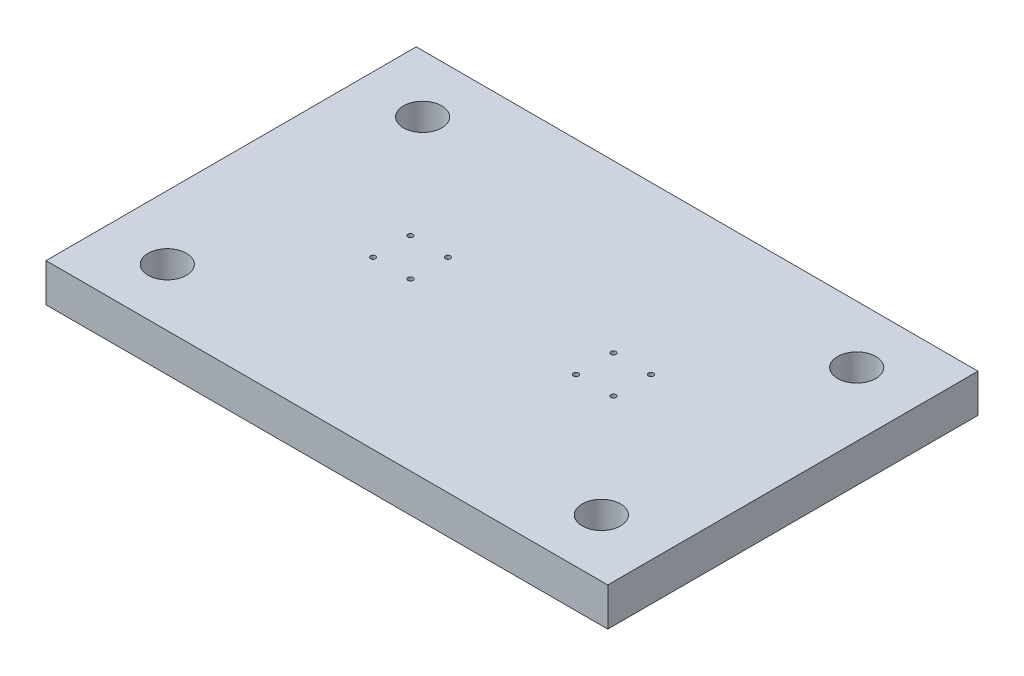
ISO-10303-21;
HEADER;
FILE_DESCRIPTION(('STEP AP214'),'2;1');
FILE_NAME('part.step','',(''),(''),'','','');
FILE_SCHEMA(('AUTOMOTIVE_DESIGN { 1 0 10303 214 1 1 1 1 }'));
ENDSEC;
DATA;
#1=APPLICATION_CONTEXT('core data for automotive mechanical design processes');
#2=APPLICATION_PROTOCOL_DEFINITION('international standard','automotive_design',2000,#1);
#3=PRODUCT_CONTEXT('',#1,'mechanical');
#4=PRODUCT('Part','Part','',(#3));
#5=PRODUCT_RELATED_PRODUCT_CATEGORY('part','',(#4));
#6=PRODUCT_DEFINITION_FORMATION('','',#4);
#7=PRODUCT_DEFINITION_CONTEXT('part definition',#1,'design');
#8=PRODUCT_DEFINITION('design','',#6,#7);
#9=PRODUCT_DEFINITION_SHAPE('','',#8);
#10=(LENGTH_UNIT() NAMED_UNIT(*) SI_UNIT(.MILLI.,.METRE.));
#11=(NAMED_UNIT(*) PLANE_ANGLE_UNIT() SI_UNIT($,.RADIAN.));
#12=(NAMED_UNIT(*) SI_UNIT($,.STERADIAN.) SOLID_ANGLE_UNIT());
#13=UNCERTAINTY_MEASURE_WITH_UNIT(LENGTH_MEASURE(1.E-05),#10,'distance_accuracy_value','');
#14=(GEOMETRIC_REPRESENTATION_CONTEXT(3) GLOBAL_UNCERTAINTY_ASSIGNED_CONTEXT((#13)) GLOBAL_UNIT_ASSIGNED_CONTEXT((#10,
#11,#12)) REPRESENTATION_CONTEXT('',''));
#15=CARTESIAN_POINT('',(0.,0.,0.));
#16=DIRECTION('',(0.,0.,1.));
#17=DIRECTION('',(1.,0.,0.));
#18=AXIS2_PLACEMENT_3D('',#15,#16,#17);
#19=CARTESIAN_POINT('',(440.,60.,-290.));
#20=DIRECTION('',(-1.,0.,0.));
#21=DIRECTION('',(0.,0.,1.));
#22=AXIS2_PLACEMENT_3D('',#19,#20,#21);
#23=PLANE('',#22);
#24=DIRECTION('',(0.,0.,-1.));
#25=VECTOR('',#24,1.);
#26=CARTESIAN_POINT('',(440.,0.,-290.));
#27=LINE('',#26,#25);
#28=CARTESIAN_POINT('',(440.,0.,290.));
#29=VERTEX_POINT('',#28);
#30=CARTESIAN_POINT('',(440.,0.,-290.));
#31=VERTEX_POINT('',#30);
#32=EDGE_CURVE('E99',#29,#31,#27,.T.);
#33=ORIENTED_EDGE('',*,*,#32,.T.);
#34=DIRECTION('',(0.,-1.,0.));
#35=VECTOR('',#34,1.);
#36=CARTESIAN_POINT('',(440.,60.,-290.));
#37=LINE('',#36,#35);
#38=CARTESIAN_POINT('',(440.,60.,-290.));
#39=VERTEX_POINT('',#38);
#40=EDGE_CURVE('E11',#39,#31,#37,.T.);
#41=ORIENTED_EDGE('',*,*,#40,.F.);
#42=DIRECTION('',(0.,0.,-1.));
#43=VECTOR('',#42,1.);
#44=CARTESIAN_POINT('',(440.,60.,-290.));
#45=LINE('',#44,#43);
#46=CARTESIAN_POINT('',(440.,60.,290.));
#47=VERTEX_POINT('',#46);
#48=EDGE_CURVE('E86',#47,#39,#45,.T.);
#49=ORIENTED_EDGE('',*,*,#48,.F.);
#50=DIRECTION('',(0.,-1.,0.));
#51=VECTOR('',#50,1.);
#52=CARTESIAN_POINT('',(440.,60.,290.));
#53=LINE('',#52,#51);
#54=EDGE_CURVE('E95',#47,#29,#53,.T.);
#55=ORIENTED_EDGE('',*,*,#54,.T.);
#56=EDGE_LOOP('',(#33,#41,#49,#55));
#57=FACE_BOUND('',#56,.T.);
#58=ADVANCED_FACE('F33',(#57),#23,.F.);
#59=CARTESIAN_POINT('',(-440.,60.,-290.));
#60=DIRECTION('',(0.,0.,1.));
#61=DIRECTION('',(1.,0.,0.));
#62=AXIS2_PLACEMENT_3D('',#59,#60,#61);
#63=PLANE('',#62);
#64=DIRECTION('',(-1.,0.,0.));
#65=VECTOR('',#64,1.);
#66=CARTESIAN_POINT('',(-440.,0.,-290.));
#67=LINE('',#66,#65);
#68=CARTESIAN_POINT('',(-440.,0.,-290.));
#69=VERTEX_POINT('',#68);
#70=EDGE_CURVE('E90',#31,#69,#67,.T.);
#71=ORIENTED_EDGE('',*,*,#70,.T.);
#72=DIRECTION('',(0.,-1.,0.));
#73=VECTOR('',#72,1.);
#74=CARTESIAN_POINT('',(-440.,60.,-290.));
#75=LINE('',#74,#73);
#76=CARTESIAN_POINT('',(-440.,60.,-290.));
#77=VERTEX_POINT('',#76);
#78=EDGE_CURVE('E42',#77,#69,#75,.T.);
#79=ORIENTED_EDGE('',*,*,#78,.F.);
#80=DIRECTION('',(-1.,0.,0.));
#81=VECTOR('',#80,1.);
#82=CARTESIAN_POINT('',(-440.,60.,-290.));
#83=LINE('',#82,#81);
#84=EDGE_CURVE('E81',#39,#77,#83,.T.);
#85=ORIENTED_EDGE('',*,*,#84,.F.);
#86=ORIENTED_EDGE('',*,*,#40,.T.);
#87=EDGE_LOOP('',(#71,#79,#85,#86));
#88=FACE_BOUND('',#87,.T.);
#89=ADVANCED_FACE('F89',(#88),#63,.F.);
#90=CARTESIAN_POINT('',(-440.,60.,-290.));
#91=DIRECTION('',(1.,0.,0.));
#92=DIRECTION('',(0.,0.,-1.));
#93=AXIS2_PLACEMENT_3D('',#90,#91,#92);
#94=PLANE('',#93);
#95=DIRECTION('',(0.,0.,1.));
#96=VECTOR('',#95,1.);
#97=CARTESIAN_POINT('',(-440.,0.,-290.));
#98=LINE('',#97,#96);
#99=CARTESIAN_POINT('',(-440.,0.,290.));
#100=VERTEX_POINT('',#99);
#101=EDGE_CURVE('E68',#69,#100,#98,.T.);
#102=ORIENTED_EDGE('',*,*,#101,.T.);
#103=DIRECTION('',(0.,-1.,0.));
#104=VECTOR('',#103,1.);
#105=CARTESIAN_POINT('',(-440.,60.,290.));
#106=LINE('',#105,#104);
#107=CARTESIAN_POINT('',(-440.,60.,290.));
#108=VERTEX_POINT('',#107);
#109=EDGE_CURVE('E91',#108,#100,#106,.T.);
#110=ORIENTED_EDGE('',*,*,#109,.F.);
#111=DIRECTION('',(0.,0.,1.));
#112=VECTOR('',#111,1.);
#113=CARTESIAN_POINT('',(-440.,60.,-290.));
#114=LINE('',#113,#112);
#115=EDGE_CURVE('E84',#77,#108,#114,.T.);
#116=ORIENTED_EDGE('',*,*,#115,.F.);
#117=ORIENTED_EDGE('',*,*,#78,.T.);
#118=EDGE_LOOP('',(#102,#110,#116,#117));
#119=FACE_BOUND('',#118,.T.);
#120=ADVANCED_FACE('F93',(#119),#94,.F.);
#121=CARTESIAN_POINT('',(-440.,60.,290.));
#122=DIRECTION('',(0.,0.,-1.));
#123=DIRECTION('',(-1.,0.,0.));
#124=AXIS2_PLACEMENT_3D('',#121,#122,#123);
#125=PLANE('',#124);
#126=DIRECTION('',(1.,0.,0.));
#127=VECTOR('',#126,1.);
#128=CARTESIAN_POINT('',(-440.,0.,290.));
#129=LINE('',#128,#127);
#130=EDGE_CURVE('E74',#100,#29,#129,.T.);
#131=ORIENTED_EDGE('',*,*,#130,.T.);
#132=ORIENTED_EDGE('',*,*,#54,.F.);
#133=DIRECTION('',(1.,0.,0.));
#134=VECTOR('',#133,1.);
#135=CARTESIAN_POINT('',(-440.,60.,290.));
#136=LINE('',#135,#134);
#137=EDGE_CURVE('E51',#108,#47,#136,.T.);
#138=ORIENTED_EDGE('',*,*,#137,.F.);
#139=ORIENTED_EDGE('',*,*,#109,.T.);
#140=EDGE_LOOP('',(#131,#132,#138,#139));
#141=FACE_BOUND('',#140,.T.);
#142=ADVANCED_FACE('F185',(#141),#125,.F.);
#143=CARTESIAN_POINT('',(0.,60.,0.));
#144=DIRECTION('',(0.,1.,0.));
#145=DIRECTION('',(0.,0.,1.));
#146=AXIS2_PLACEMENT_3D('',#143,#144,#145);
#147=PLANE('',#146);
#148=CARTESIAN_POINT('',(129.655068580758,60.,-29.3449314192418));
#149=DIRECTION('',(0.,1.,0.));
#150=DIRECTION('',(0.,0.,-1.));
#151=AXIS2_PLACEMENT_3D('',#148,#149,#150);
#152=CIRCLE('',#151,3.99999999999999);
#153=CARTESIAN_POINT('',(129.655068580758,60.,-33.3449314192418));
#154=VERTEX_POINT('',#153);
#155=EDGE_CURVE('E158',#154,#154,#152,.T.);
#156=ORIENTED_EDGE('',*,*,#155,.F.);
#157=EDGE_LOOP('',(#156));
#158=FACE_BOUND('',#157,.T.);
#159=CARTESIAN_POINT('',(129.655068580758,60.,29.3449314192418));
#160=DIRECTION('',(0.,1.,0.));
#161=DIRECTION('',(0.,0.,-1.));
#162=AXIS2_PLACEMENT_3D('',#159,#160,#161);
#163=CIRCLE('',#162,3.99999999999999);
#164=CARTESIAN_POINT('',(129.655068580758,60.,25.3449314192418));
#165=VERTEX_POINT('',#164);
#166=EDGE_CURVE('E148',#165,#165,#163,.T.);
#167=ORIENTED_EDGE('',*,*,#166,.F.);
#168=EDGE_LOOP('',(#167));
#169=FACE_BOUND('',#168,.T.);
#170=CARTESIAN_POINT('',(188.344931419241,60.,29.3449314192424));
#171=DIRECTION('',(0.,1.,0.));
#172=DIRECTION('',(0.,0.,-1.));
#173=AXIS2_PLACEMENT_3D('',#170,#171,#172);
#174=CIRCLE('',#173,4.00000000000001);
#175=CARTESIAN_POINT('',(188.344931419241,60.,25.3449314192424));
#176=VERTEX_POINT('',#175);
#177=EDGE_CURVE('E145',#176,#176,#174,.T.);
#178=ORIENTED_EDGE('',*,*,#177,.F.);
#179=EDGE_LOOP('',(#178));
#180=FACE_BOUND('',#179,.T.);
#181=CARTESIAN_POINT('',(188.344931419241,60.,-29.3449314192412));
#182=DIRECTION('',(0.,1.,0.));
#183=DIRECTION('',(0.,0.,-1.));
#184=AXIS2_PLACEMENT_3D('',#181,#182,#183);
#185=CIRCLE('',#184,4.);
#186=CARTESIAN_POINT('',(188.344931419241,60.,-33.3449314192412));
#187=VERTEX_POINT('',#186);
#188=EDGE_CURVE('E142',#187,#187,#185,.T.);
#189=ORIENTED_EDGE('',*,*,#188,.F.);
#190=EDGE_LOOP('',(#189));
#191=FACE_BOUND('',#190,.T.);
#192=CARTESIAN_POINT('',(-188.344931419241,60.,-29.3449314192412));
#193=DIRECTION('',(0.,1.,0.));
#194=DIRECTION('',(0.,0.,1.));
#195=AXIS2_PLACEMENT_3D('',#192,#193,#194);
#196=CIRCLE('',#195,4.);
#197=CARTESIAN_POINT('',(-188.344931419241,60.,-25.3449314192412));
#198=VERTEX_POINT('',#197);
#199=EDGE_CURVE('E138',#198,#198,#196,.T.);
#200=ORIENTED_EDGE('',*,*,#199,.F.);
#201=EDGE_LOOP('',(#200));
#202=FACE_BOUND('',#201,.T.);
#203=CARTESIAN_POINT('',(-188.344931419241,60.,29.3449314192424));
#204=DIRECTION('',(0.,1.,0.));
#205=DIRECTION('',(0.,0.,1.));
#206=AXIS2_PLACEMENT_3D('',#203,#204,#205);
#207=CIRCLE('',#206,4.00000000000001);
#208=CARTESIAN_POINT('',(-188.344931419241,60.,33.3449314192424));
#209=VERTEX_POINT('',#208);
#210=EDGE_CURVE('E134',#209,#209,#207,.T.);
#211=ORIENTED_EDGE('',*,*,#210,.F.);
#212=EDGE_LOOP('',(#211));
#213=FACE_BOUND('',#212,.T.);
#214=CARTESIAN_POINT('',(-129.655068580758,60.,29.3449314192418));
#215=DIRECTION('',(0.,1.,0.));
#216=DIRECTION('',(0.,0.,1.));
#217=AXIS2_PLACEMENT_3D('',#214,#215,#216);
#218=CIRCLE('',#217,3.99999999999999);
#219=CARTESIAN_POINT('',(-129.655068580758,60.,33.3449314192418));
#220=VERTEX_POINT('',#219);
#221=EDGE_CURVE('E130',#220,#220,#218,.T.);
#222=ORIENTED_EDGE('',*,*,#221,.F.);
#223=EDGE_LOOP('',(#222));
#224=FACE_BOUND('',#223,.T.);
#225=CARTESIAN_POINT('',(-129.655068580758,60.,-29.3449314192418));
#226=DIRECTION('',(0.,1.,0.));
#227=DIRECTION('',(0.,0.,1.));
#228=AXIS2_PLACEMENT_3D('',#225,#226,#227);
#229=CIRCLE('',#228,3.99999999999999);
#230=CARTESIAN_POINT('',(-129.655068580758,60.,-25.3449314192418));
#231=VERTEX_POINT('',#230);
#232=EDGE_CURVE('E126',#231,#231,#229,.T.);
#233=ORIENTED_EDGE('',*,*,#232,.F.);
#234=EDGE_LOOP('',(#233));
#235=FACE_BOUND('',#234,.T.);
#236=CARTESIAN_POINT('',(-340.,60.,200.));
#237=DIRECTION('',(0.,1.,0.));
#238=DIRECTION('',(0.,0.,-1.));
#239=AXIS2_PLACEMENT_3D('',#236,#237,#238);
#240=CIRCLE('',#239,30.);
#241=CARTESIAN_POINT('',(-340.,60.,170.));
#242=VERTEX_POINT('',#241);
#243=EDGE_CURVE('E122',#242,#242,#240,.T.);
#244=ORIENTED_EDGE('',*,*,#243,.F.);
#245=EDGE_LOOP('',(#244));
#246=FACE_BOUND('',#245,.T.);
#247=CARTESIAN_POINT('',(340.,60.,200.));
#248=DIRECTION('',(0.,1.,0.));
#249=DIRECTION('',(0.,0.,-1.));
#250=AXIS2_PLACEMENT_3D('',#247,#248,#249);
#251=CIRCLE('',#250,30.);
#252=CARTESIAN_POINT('',(340.,60.,170.));
#253=VERTEX_POINT('',#252);
#254=EDGE_CURVE('E118',#253,#253,#251,.T.);
#255=ORIENTED_EDGE('',*,*,#254,.F.);
#256=EDGE_LOOP('',(#255));
#257=FACE_BOUND('',#256,.T.);
#258=CARTESIAN_POINT('',(340.,60.,-200.));
#259=DIRECTION('',(0.,1.,0.));
#260=DIRECTION('',(0.,0.,1.));
#261=AXIS2_PLACEMENT_3D('',#258,#259,#260);
#262=CIRCLE('',#261,30.);
#263=CARTESIAN_POINT('',(340.,60.,-170.));
#264=VERTEX_POINT('',#263);
#265=EDGE_CURVE('E114',#264,#264,#262,.T.);
#266=ORIENTED_EDGE('',*,*,#265,.F.);
#267=EDGE_LOOP('',(#266));
#268=FACE_BOUND('',#267,.T.);
#269=CARTESIAN_POINT('',(-340.,60.,-200.));
#270=DIRECTION('',(0.,1.,0.));
#271=DIRECTION('',(0.,0.,1.));
#272=AXIS2_PLACEMENT_3D('',#269,#270,#271);
#273=CIRCLE('',#272,30.);
#274=CARTESIAN_POINT('',(-340.,60.,-170.));
#275=VERTEX_POINT('',#274);
#276=EDGE_CURVE('E110',#275,#275,#273,.T.);
#277=ORIENTED_EDGE('',*,*,#276,.F.);
#278=EDGE_LOOP('',(#277));
#279=FACE_BOUND('',#278,.T.);
#280=ORIENTED_EDGE('',*,*,#48,.T.);
#281=ORIENTED_EDGE('',*,*,#84,.T.);
#282=ORIENTED_EDGE('',*,*,#115,.T.);
#283=ORIENTED_EDGE('',*,*,#137,.T.);
#284=EDGE_LOOP('',(#280,#281,#282,#283));
#285=FACE_BOUND('',#284,.T.);
#286=ADVANCED_FACE('F82',(#158,#169,#180,#191,#202,#213,#224,#235,#246,#257,#268,#279,#285),
#147,.T.);
#287=CARTESIAN_POINT('',(0.,0.,0.));
#288=DIRECTION('',(0.,1.,0.));
#289=DIRECTION('',(0.,0.,1.));
#290=AXIS2_PLACEMENT_3D('',#287,#288,#289);
#291=PLANE('',#290);
#292=CARTESIAN_POINT('',(129.655068580758,0.,-29.3449314192418));
#293=DIRECTION('',(0.,1.,0.));
#294=DIRECTION('',(0.,0.,1.));
#295=AXIS2_PLACEMENT_3D('',#292,#293,#294);
#296=CIRCLE('',#295,3.99999999999999);
#297=CARTESIAN_POINT('',(129.655068580758,0.,-25.3449314192418));
#298=VERTEX_POINT('',#297);
#299=EDGE_CURVE('E36',#298,#298,#296,.T.);
#300=ORIENTED_EDGE('',*,*,#299,.T.);
#301=EDGE_LOOP('',(#300));
#302=FACE_BOUND('',#301,.T.);
#303=CARTESIAN_POINT('',(129.655068580758,0.,29.3449314192418));
#304=DIRECTION('',(0.,1.,0.));
#305=DIRECTION('',(0.,0.,1.));
#306=AXIS2_PLACEMENT_3D('',#303,#304,#305);
#307=CIRCLE('',#306,3.99999999999999);
#308=CARTESIAN_POINT('',(129.655068580758,0.,33.3449314192418));
#309=VERTEX_POINT('',#308);
#310=EDGE_CURVE('E146',#309,#309,#307,.T.);
#311=ORIENTED_EDGE('',*,*,#310,.T.);
#312=EDGE_LOOP('',(#311));
#313=FACE_BOUND('',#312,.T.);
#314=CARTESIAN_POINT('',(188.344931419241,0.,29.3449314192424));
#315=DIRECTION('',(0.,1.,0.));
#316=DIRECTION('',(0.,0.,1.));
#317=AXIS2_PLACEMENT_3D('',#314,#315,#316);
#318=CIRCLE('',#317,4.00000000000001);
#319=CARTESIAN_POINT('',(188.344931419241,0.,33.3449314192424));
#320=VERTEX_POINT('',#319);
#321=EDGE_CURVE('E143',#320,#320,#318,.T.);
#322=ORIENTED_EDGE('',*,*,#321,.T.);
#323=EDGE_LOOP('',(#322));
#324=FACE_BOUND('',#323,.T.);
#325=CARTESIAN_POINT('',(188.344931419241,0.,-29.3449314192412));
#326=DIRECTION('',(0.,1.,0.));
#327=DIRECTION('',(0.,0.,1.));
#328=AXIS2_PLACEMENT_3D('',#325,#326,#327);
#329=CIRCLE('',#328,4.);
#330=CARTESIAN_POINT('',(188.344931419241,0.,-25.3449314192412));
#331=VERTEX_POINT('',#330);
#332=EDGE_CURVE('E139',#331,#331,#329,.T.);
#333=ORIENTED_EDGE('',*,*,#332,.T.);
#334=EDGE_LOOP('',(#333));
#335=FACE_BOUND('',#334,.T.);
#336=CARTESIAN_POINT('',(-188.344931419241,0.,-29.3449314192412));
#337=DIRECTION('',(0.,1.,0.));
#338=DIRECTION('',(0.,0.,1.));
#339=AXIS2_PLACEMENT_3D('',#336,#337,#338);
#340=CIRCLE('',#339,4.);
#341=CARTESIAN_POINT('',(-188.344931419241,0.,-25.3449314192412));
#342=VERTEX_POINT('',#341);
#343=EDGE_CURVE('E135',#342,#342,#340,.T.);
#344=ORIENTED_EDGE('',*,*,#343,.T.);
#345=EDGE_LOOP('',(#344));
#346=FACE_BOUND('',#345,.T.);
#347=CARTESIAN_POINT('',(-188.344931419241,0.,29.3449314192424));
#348=DIRECTION('',(0.,1.,0.));
#349=DIRECTION('',(0.,0.,1.));
#350=AXIS2_PLACEMENT_3D('',#347,#348,#349);
#351=CIRCLE('',#350,4.00000000000001);
#352=CARTESIAN_POINT('',(-188.344931419241,0.,33.3449314192424));
#353=VERTEX_POINT('',#352);
#354=EDGE_CURVE('E131',#353,#353,#351,.T.);
#355=ORIENTED_EDGE('',*,*,#354,.T.);
#356=EDGE_LOOP('',(#355));
#357=FACE_BOUND('',#356,.T.);
#358=CARTESIAN_POINT('',(-129.655068580758,0.,29.3449314192418));
#359=DIRECTION('',(0.,1.,0.));
#360=DIRECTION('',(0.,0.,1.));
#361=AXIS2_PLACEMENT_3D('',#358,#359,#360);
#362=CIRCLE('',#361,3.99999999999999);
#363=CARTESIAN_POINT('',(-129.655068580758,0.,33.3449314192418));
#364=VERTEX_POINT('',#363);
#365=EDGE_CURVE('E127',#364,#364,#362,.T.);
#366=ORIENTED_EDGE('',*,*,#365,.T.);
#367=EDGE_LOOP('',(#366));
#368=FACE_BOUND('',#367,.T.);
#369=CARTESIAN_POINT('',(-129.655068580758,0.,-29.3449314192418));
#370=DIRECTION('',(0.,1.,0.));
#371=DIRECTION('',(0.,0.,1.));
#372=AXIS2_PLACEMENT_3D('',#369,#370,#371);
#373=CIRCLE('',#372,3.99999999999999);
#374=CARTESIAN_POINT('',(-129.655068580758,0.,-25.3449314192418));
#375=VERTEX_POINT('',#374);
#376=EDGE_CURVE('E123',#375,#375,#373,.T.);
#377=ORIENTED_EDGE('',*,*,#376,.T.);
#378=EDGE_LOOP('',(#377));
#379=FACE_BOUND('',#378,.T.);
#380=CARTESIAN_POINT('',(-340.,0.,200.));
#381=DIRECTION('',(0.,1.,0.));
#382=DIRECTION('',(0.,0.,1.));
#383=AXIS2_PLACEMENT_3D('',#380,#381,#382);
#384=CIRCLE('',#383,30.);
#385=CARTESIAN_POINT('',(-340.,0.,230.));
#386=VERTEX_POINT('',#385);
#387=EDGE_CURVE('E119',#386,#386,#384,.T.);
#388=ORIENTED_EDGE('',*,*,#387,.T.);
#389=EDGE_LOOP('',(#388));
#390=FACE_BOUND('',#389,.T.);
#391=CARTESIAN_POINT('',(340.,0.,200.));
#392=DIRECTION('',(0.,1.,0.));
#393=DIRECTION('',(0.,0.,1.));
#394=AXIS2_PLACEMENT_3D('',#391,#392,#393);
#395=CIRCLE('',#394,30.);
#396=CARTESIAN_POINT('',(340.,0.,230.));
#397=VERTEX_POINT('',#396);
#398=EDGE_CURVE('E115',#397,#397,#395,.T.);
#399=ORIENTED_EDGE('',*,*,#398,.T.);
#400=EDGE_LOOP('',(#399));
#401=FACE_BOUND('',#400,.T.);
#402=CARTESIAN_POINT('',(340.,0.,-200.));
#403=DIRECTION('',(0.,1.,0.));
#404=DIRECTION('',(0.,0.,1.));
#405=AXIS2_PLACEMENT_3D('',#402,#403,#404);
#406=CIRCLE('',#405,30.);
#407=CARTESIAN_POINT('',(340.,0.,-170.));
#408=VERTEX_POINT('',#407);
#409=EDGE_CURVE('E111',#408,#408,#406,.T.);
#410=ORIENTED_EDGE('',*,*,#409,.T.);
#411=EDGE_LOOP('',(#410));
#412=FACE_BOUND('',#411,.T.);
#413=CARTESIAN_POINT('',(-340.,0.,-200.));
#414=DIRECTION('',(0.,1.,0.));
#415=DIRECTION('',(0.,0.,1.));
#416=AXIS2_PLACEMENT_3D('',#413,#414,#415);
#417=CIRCLE('',#416,30.);
#418=CARTESIAN_POINT('',(-340.,0.,-170.));
#419=VERTEX_POINT('',#418);
#420=EDGE_CURVE('E102',#419,#419,#417,.T.);
#421=ORIENTED_EDGE('',*,*,#420,.T.);
#422=EDGE_LOOP('',(#421));
#423=FACE_BOUND('',#422,.T.);
#424=ORIENTED_EDGE('',*,*,#32,.F.);
#425=ORIENTED_EDGE('',*,*,#130,.F.);
#426=ORIENTED_EDGE('',*,*,#101,.F.);
#427=ORIENTED_EDGE('',*,*,#70,.F.);
#428=EDGE_LOOP('',(#424,#425,#426,#427));
#429=FACE_BOUND('',#428,.T.);
#430=ADVANCED_FACE('F184',(#302,#313,#324,#335,#346,#357,#368,#379,#390,#401,#412,#423,#429),
#291,.F.);
#431=CARTESIAN_POINT('',(-340.,-200.,-200.));
#432=DIRECTION('',(0.,1.,0.));
#433=DIRECTION('',(0.,0.,1.));
#434=AXIS2_PLACEMENT_3D('',#431,#432,#433);
#435=CYLINDRICAL_SURFACE('',#434,30.);
#436=ORIENTED_EDGE('',*,*,#276,.T.);
#437=EDGE_LOOP('',(#436));
#438=FACE_BOUND('',#437,.T.);
#439=ORIENTED_EDGE('',*,*,#420,.F.);
#440=EDGE_LOOP('',(#439));
#441=FACE_BOUND('',#440,.T.);
#442=ADVANCED_FACE('F180',(#438,#441),#435,.F.);
#443=CARTESIAN_POINT('',(340.,-200.,-200.));
#444=DIRECTION('',(0.,1.,0.));
#445=DIRECTION('',(0.,0.,1.));
#446=AXIS2_PLACEMENT_3D('',#443,#444,#445);
#447=CYLINDRICAL_SURFACE('',#446,30.);
#448=ORIENTED_EDGE('',*,*,#265,.T.);
#449=EDGE_LOOP('',(#448));
#450=FACE_BOUND('',#449,.T.);
#451=ORIENTED_EDGE('',*,*,#409,.F.);
#452=EDGE_LOOP('',(#451));
#453=FACE_BOUND('',#452,.T.);
#454=ADVANCED_FACE('F234',(#450,#453),#447,.F.);
#455=CARTESIAN_POINT('',(340.,-200.,200.));
#456=DIRECTION('',(0.,1.,0.));
#457=DIRECTION('',(0.,0.,1.));
#458=AXIS2_PLACEMENT_3D('',#455,#456,#457);
#459=CYLINDRICAL_SURFACE('',#458,30.);
#460=ORIENTED_EDGE('',*,*,#254,.T.);
#461=EDGE_LOOP('',(#460));
#462=FACE_BOUND('',#461,.T.);
#463=ORIENTED_EDGE('',*,*,#398,.F.);
#464=EDGE_LOOP('',(#463));
#465=FACE_BOUND('',#464,.T.);
#466=ADVANCED_FACE('F239',(#462,#465),#459,.F.);
#467=CARTESIAN_POINT('',(-340.,-200.,200.));
#468=DIRECTION('',(0.,1.,0.));
#469=DIRECTION('',(0.,0.,1.));
#470=AXIS2_PLACEMENT_3D('',#467,#468,#469);
#471=CYLINDRICAL_SURFACE('',#470,30.);
#472=ORIENTED_EDGE('',*,*,#243,.T.);
#473=EDGE_LOOP('',(#472));
#474=FACE_BOUND('',#473,.T.);
#475=ORIENTED_EDGE('',*,*,#387,.F.);
#476=EDGE_LOOP('',(#475));
#477=FACE_BOUND('',#476,.T.);
#478=ADVANCED_FACE('F247',(#474,#477),#471,.F.);
#479=CARTESIAN_POINT('',(-129.655068580758,-200.,-29.3449314192418));
#480=DIRECTION('',(0.,1.,0.));
#481=DIRECTION('',(0.,0.,1.));
#482=AXIS2_PLACEMENT_3D('',#479,#480,#481);
#483=CYLINDRICAL_SURFACE('',#482,3.99999999999999);
#484=ORIENTED_EDGE('',*,*,#232,.T.);
#485=EDGE_LOOP('',(#484));
#486=FACE_BOUND('',#485,.T.);
#487=ORIENTED_EDGE('',*,*,#376,.F.);
#488=EDGE_LOOP('',(#487));
#489=FACE_BOUND('',#488,.T.);
#490=ADVANCED_FACE('F254',(#486,#489),#483,.F.);
#491=CARTESIAN_POINT('',(-129.655068580758,-200.,29.3449314192418));
#492=DIRECTION('',(0.,1.,0.));
#493=DIRECTION('',(0.,0.,1.));
#494=AXIS2_PLACEMENT_3D('',#491,#492,#493);
#495=CYLINDRICAL_SURFACE('',#494,3.99999999999999);
#496=ORIENTED_EDGE('',*,*,#221,.T.);
#497=EDGE_LOOP('',(#496));
#498=FACE_BOUND('',#497,.T.);
#499=ORIENTED_EDGE('',*,*,#365,.F.);
#500=EDGE_LOOP('',(#499));
#501=FACE_BOUND('',#500,.T.);
#502=ADVANCED_FACE('F261',(#498,#501),#495,.F.);
#503=CARTESIAN_POINT('',(-188.344931419241,-200.,29.3449314192424));
#504=DIRECTION('',(0.,1.,0.));
#505=DIRECTION('',(0.,0.,1.));
#506=AXIS2_PLACEMENT_3D('',#503,#504,#505);
#507=CYLINDRICAL_SURFACE('',#506,4.00000000000001);
#508=ORIENTED_EDGE('',*,*,#210,.T.);
#509=EDGE_LOOP('',(#508));
#510=FACE_BOUND('',#509,.T.);
#511=ORIENTED_EDGE('',*,*,#354,.F.);
#512=EDGE_LOOP('',(#511));
#513=FACE_BOUND('',#512,.T.);
#514=ADVANCED_FACE('F269',(#510,#513),#507,.F.);
#515=CARTESIAN_POINT('',(-188.344931419241,-200.,-29.3449314192412));
#516=DIRECTION('',(0.,1.,0.));
#517=DIRECTION('',(0.,0.,1.));
#518=AXIS2_PLACEMENT_3D('',#515,#516,#517);
#519=CYLINDRICAL_SURFACE('',#518,4.);
#520=ORIENTED_EDGE('',*,*,#199,.T.);
#521=EDGE_LOOP('',(#520));
#522=FACE_BOUND('',#521,.T.);
#523=ORIENTED_EDGE('',*,*,#343,.F.);
#524=EDGE_LOOP('',(#523));
#525=FACE_BOUND('',#524,.T.);
#526=ADVANCED_FACE('F277',(#522,#525),#519,.F.);
#527=CARTESIAN_POINT('',(188.344931419241,-200.,-29.3449314192412));
#528=DIRECTION('',(0.,1.,0.));
#529=DIRECTION('',(0.,0.,1.));
#530=AXIS2_PLACEMENT_3D('',#527,#528,#529);
#531=CYLINDRICAL_SURFACE('',#530,4.);
#532=ORIENTED_EDGE('',*,*,#188,.T.);
#533=EDGE_LOOP('',(#532));
#534=FACE_BOUND('',#533,.T.);
#535=ORIENTED_EDGE('',*,*,#332,.F.);
#536=EDGE_LOOP('',(#535));
#537=FACE_BOUND('',#536,.T.);
#538=ADVANCED_FACE('F285',(#534,#537),#531,.F.);
#539=CARTESIAN_POINT('',(188.344931419241,-200.,29.3449314192424));
#540=DIRECTION('',(0.,1.,0.));
#541=DIRECTION('',(0.,0.,1.));
#542=AXIS2_PLACEMENT_3D('',#539,#540,#541);
#543=CYLINDRICAL_SURFACE('',#542,4.00000000000001);
#544=ORIENTED_EDGE('',*,*,#177,.T.);
#545=EDGE_LOOP('',(#544));
#546=FACE_BOUND('',#545,.T.);
#547=ORIENTED_EDGE('',*,*,#321,.F.);
#548=EDGE_LOOP('',(#547));
#549=FACE_BOUND('',#548,.T.);
#550=ADVANCED_FACE('F293',(#546,#549),#543,.F.);
#551=CARTESIAN_POINT('',(129.655068580758,-200.,29.3449314192418));
#552=DIRECTION('',(0.,1.,0.));
#553=DIRECTION('',(0.,0.,1.));
#554=AXIS2_PLACEMENT_3D('',#551,#552,#553);
#555=CYLINDRICAL_SURFACE('',#554,3.99999999999999);
#556=ORIENTED_EDGE('',*,*,#166,.T.);
#557=EDGE_LOOP('',(#556));
#558=FACE_BOUND('',#557,.T.);
#559=ORIENTED_EDGE('',*,*,#310,.F.);
#560=EDGE_LOOP('',(#559));
#561=FACE_BOUND('',#560,.T.);
#562=ADVANCED_FACE('F301',(#558,#561),#555,.F.);
#563=CARTESIAN_POINT('',(129.655068580758,-200.,-29.3449314192418));
#564=DIRECTION('',(0.,1.,0.));
#565=DIRECTION('',(0.,0.,1.));
#566=AXIS2_PLACEMENT_3D('',#563,#564,#565);
#567=CYLINDRICAL_SURFACE('',#566,3.99999999999999);
#568=ORIENTED_EDGE('',*,*,#155,.T.);
#569=EDGE_LOOP('',(#568));
#570=FACE_BOUND('',#569,.T.);
#571=ORIENTED_EDGE('',*,*,#299,.F.);
#572=EDGE_LOOP('',(#571));
#573=FACE_BOUND('',#572,.T.);
#574=ADVANCED_FACE('F309',(#570,#573),#567,.F.);
#575=CLOSED_SHELL('',(#58,#89,#120,#142,#286,#430,#442,#454,#466,#478,#490,#502,#514,#526,#538,
#550,#562,#574));
#576=MANIFOLD_SOLID_BREP('B2',#575);
#577=ADVANCED_BREP_SHAPE_REPRESENTATION('',(#18,#576),#14);
#578=SHAPE_DEFINITION_REPRESENTATION(#9,#577);
ENDSEC;
END-ISO-10303-21;
